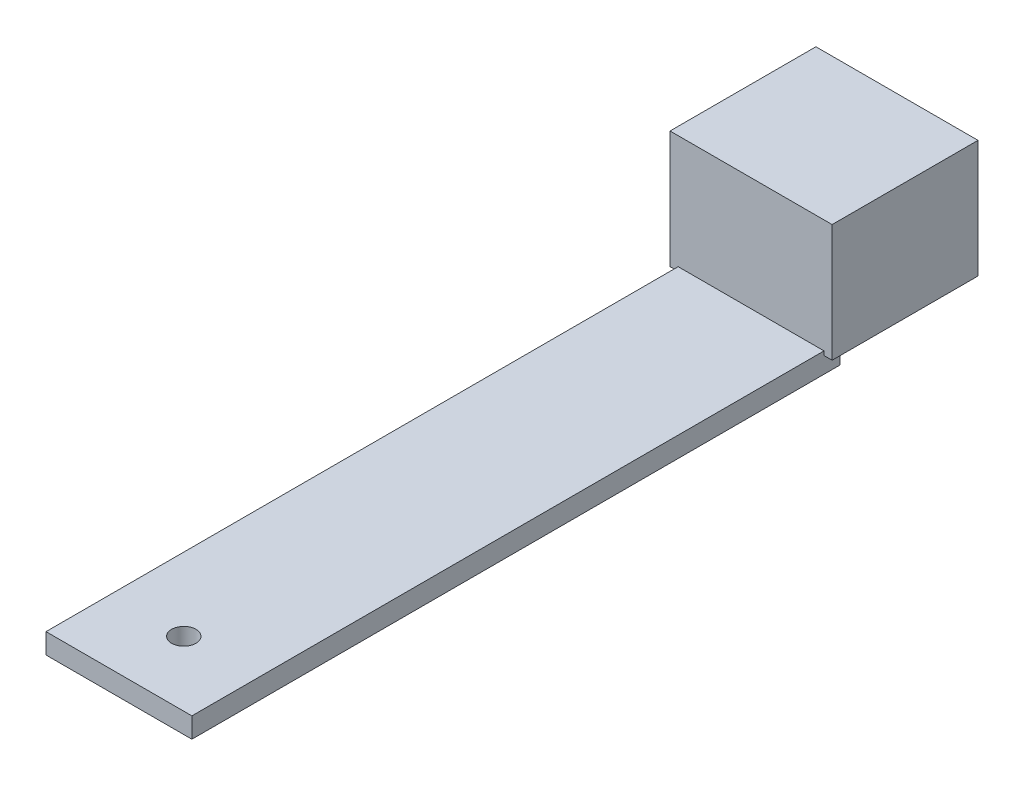
ISO-10303-21;
HEADER;
FILE_DESCRIPTION(('STEP AP214'),'2;1');
FILE_NAME('part.step','',(''),(''),'','','');
FILE_SCHEMA(('AUTOMOTIVE_DESIGN { 1 0 10303 214 1 1 1 1 }'));
ENDSEC;
DATA;
#1=APPLICATION_CONTEXT('core data for automotive mechanical design processes');
#2=APPLICATION_PROTOCOL_DEFINITION('international standard','automotive_design',2000,#1);
#3=PRODUCT_CONTEXT('',#1,'mechanical');
#4=PRODUCT('Part','Part','',(#3));
#5=PRODUCT_RELATED_PRODUCT_CATEGORY('part','',(#4));
#6=PRODUCT_DEFINITION_FORMATION('','',#4);
#7=PRODUCT_DEFINITION_CONTEXT('part definition',#1,'design');
#8=PRODUCT_DEFINITION('design','',#6,#7);
#9=PRODUCT_DEFINITION_SHAPE('','',#8);
#10=(LENGTH_UNIT() NAMED_UNIT(*) SI_UNIT(.MILLI.,.METRE.));
#11=(NAMED_UNIT(*) PLANE_ANGLE_UNIT() SI_UNIT($,.RADIAN.));
#12=(NAMED_UNIT(*) SI_UNIT($,.STERADIAN.) SOLID_ANGLE_UNIT());
#13=UNCERTAINTY_MEASURE_WITH_UNIT(LENGTH_MEASURE(1.E-05),#10,'distance_accuracy_value','');
#14=(GEOMETRIC_REPRESENTATION_CONTEXT(3) GLOBAL_UNCERTAINTY_ASSIGNED_CONTEXT((#13)) GLOBAL_UNIT_ASSIGNED_CONTEXT((#10,
#11,#12)) REPRESENTATION_CONTEXT('',''));
#15=CARTESIAN_POINT('',(0.,0.,0.));
#16=DIRECTION('',(0.,0.,1.));
#17=DIRECTION('',(1.,0.,0.));
#18=AXIS2_PLACEMENT_3D('',#15,#16,#17);
#19=CARTESIAN_POINT('',(-9.,-18.2,7.99999999999999));
#20=DIRECTION('',(1.,0.,0.));
#21=DIRECTION('',(0.,0.,-1.));
#22=AXIS2_PLACEMENT_3D('',#19,#20,#21);
#23=PLANE('',#22);
#24=DIRECTION('',(0.,0.,1.));
#25=VECTOR('',#24,1.);
#26=CARTESIAN_POINT('',(-9.,-18.7,7.99999999999999));
#27=LINE('',#26,#25);
#28=CARTESIAN_POINT('',(-9.,-18.7,-72.));
#29=VERTEX_POINT('',#28);
#30=CARTESIAN_POINT('',(-9.,-18.7,-70.));
#31=VERTEX_POINT('',#30);
#32=EDGE_CURVE('E121',#29,#31,#27,.T.);
#33=ORIENTED_EDGE('',*,*,#32,.F.);
#34=DIRECTION('',(0.,-1.,0.));
#35=VECTOR('',#34,1.);
#36=CARTESIAN_POINT('',(-9.,-18.2,-72.));
#37=LINE('',#36,#35);
#38=CARTESIAN_POINT('',(-9.,-20.7,-72.));
#39=VERTEX_POINT('',#38);
#40=EDGE_CURVE('E154',#29,#39,#37,.T.);
#41=ORIENTED_EDGE('',*,*,#40,.T.);
#42=DIRECTION('',(0.,0.,-1.));
#43=VECTOR('',#42,1.);
#44=CARTESIAN_POINT('',(-9.,-20.7,7.99999999999999));
#45=LINE('',#44,#43);
#46=CARTESIAN_POINT('',(-9.,-20.7,7.99999999999999));
#47=VERTEX_POINT('',#46);
#48=EDGE_CURVE('E178',#47,#39,#45,.T.);
#49=ORIENTED_EDGE('',*,*,#48,.F.);
#50=DIRECTION('',(0.,-1.,0.));
#51=VECTOR('',#50,1.);
#52=CARTESIAN_POINT('',(-9.,-18.2,7.99999999999999));
#53=LINE('',#52,#51);
#54=CARTESIAN_POINT('',(-9.,-18.2,7.99999999999999));
#55=VERTEX_POINT('',#54);
#56=EDGE_CURVE('E156',#55,#47,#53,.T.);
#57=ORIENTED_EDGE('',*,*,#56,.F.);
#58=DIRECTION('',(0.,0.,-1.));
#59=VECTOR('',#58,1.);
#60=CARTESIAN_POINT('',(-9.,-18.2,7.99999999999999));
#61=LINE('',#60,#59);
#62=CARTESIAN_POINT('',(-9.,-18.2,-70.));
#63=VERTEX_POINT('',#62);
#64=EDGE_CURVE('E167',#55,#63,#61,.T.);
#65=ORIENTED_EDGE('',*,*,#64,.T.);
#66=DIRECTION('',(0.,-1.,0.));
#67=VECTOR('',#66,1.);
#68=CARTESIAN_POINT('',(-9.,-18.2,-70.));
#69=LINE('',#68,#67);
#70=EDGE_CURVE('E53',#63,#31,#69,.T.);
#71=ORIENTED_EDGE('',*,*,#70,.T.);
#72=EDGE_LOOP('',(#33,#41,#49,#57,#65,#71));
#73=FACE_BOUND('',#72,.T.);
#74=ADVANCED_FACE('F39',(#73),#23,.F.);
#75=CARTESIAN_POINT('',(9.,-20.7,7.99999999999999));
#76=DIRECTION('',(-1.,0.,0.));
#77=DIRECTION('',(0.,0.,1.));
#78=AXIS2_PLACEMENT_3D('',#75,#76,#77);
#79=PLANE('',#78);
#80=DIRECTION('',(0.,0.,-1.));
#81=VECTOR('',#80,1.);
#82=CARTESIAN_POINT('',(9.,-18.7,7.99999999999999));
#83=LINE('',#82,#81);
#84=CARTESIAN_POINT('',(9.,-18.7,-70.));
#85=VERTEX_POINT('',#84);
#86=CARTESIAN_POINT('',(9.,-18.7,-72.));
#87=VERTEX_POINT('',#86);
#88=EDGE_CURVE('E61',#85,#87,#83,.T.);
#89=ORIENTED_EDGE('',*,*,#88,.F.);
#90=DIRECTION('',(0.,1.,0.));
#91=VECTOR('',#90,1.);
#92=CARTESIAN_POINT('',(9.,-20.7,-70.));
#93=LINE('',#92,#91);
#94=CARTESIAN_POINT('',(9.,-18.2,-70.));
#95=VERTEX_POINT('',#94);
#96=EDGE_CURVE('E155',#85,#95,#93,.T.);
#97=ORIENTED_EDGE('',*,*,#96,.T.);
#98=DIRECTION('',(0.,0.,-1.));
#99=VECTOR('',#98,1.);
#100=CARTESIAN_POINT('',(9.,-18.2,7.99999999999999));
#101=LINE('',#100,#99);
#102=CARTESIAN_POINT('',(9.,-18.2,7.99999999999999));
#103=VERTEX_POINT('',#102);
#104=EDGE_CURVE('E171',#103,#95,#101,.T.);
#105=ORIENTED_EDGE('',*,*,#104,.F.);
#106=DIRECTION('',(0.,1.,0.));
#107=VECTOR('',#106,1.);
#108=CARTESIAN_POINT('',(9.,-20.7,7.99999999999999));
#109=LINE('',#108,#107);
#110=CARTESIAN_POINT('',(9.,-20.7,7.99999999999999));
#111=VERTEX_POINT('',#110);
#112=EDGE_CURVE('E165',#111,#103,#109,.T.);
#113=ORIENTED_EDGE('',*,*,#112,.F.);
#114=DIRECTION('',(0.,0.,-1.));
#115=VECTOR('',#114,1.);
#116=CARTESIAN_POINT('',(9.,-20.7,7.99999999999999));
#117=LINE('',#116,#115);
#118=CARTESIAN_POINT('',(9.,-20.7,-72.));
#119=VERTEX_POINT('',#118);
#120=EDGE_CURVE('E172',#111,#119,#117,.T.);
#121=ORIENTED_EDGE('',*,*,#120,.T.);
#122=DIRECTION('',(0.,1.,0.));
#123=VECTOR('',#122,1.);
#124=CARTESIAN_POINT('',(9.,-20.7,-72.));
#125=LINE('',#124,#123);
#126=EDGE_CURVE('E159',#119,#87,#125,.T.);
#127=ORIENTED_EDGE('',*,*,#126,.T.);
#128=EDGE_LOOP('',(#89,#97,#105,#113,#121,#127));
#129=FACE_BOUND('',#128,.T.);
#130=ADVANCED_FACE('F189',(#129),#79,.F.);
#131=CARTESIAN_POINT('',(0.,0.,-72.));
#132=DIRECTION('',(0.,0.,1.));
#133=DIRECTION('',(1.,0.,0.));
#134=AXIS2_PLACEMENT_3D('',#131,#132,#133);
#135=PLANE('',#134);
#136=DIRECTION('',(-1.,0.,0.));
#137=VECTOR('',#136,1.);
#138=CARTESIAN_POINT('',(0.,-18.7,-72.));
#139=LINE('',#138,#137);
#140=EDGE_CURVE('E50',#87,#29,#139,.T.);
#141=ORIENTED_EDGE('',*,*,#140,.F.);
#142=ORIENTED_EDGE('',*,*,#126,.F.);
#143=DIRECTION('',(1.,0.,0.));
#144=VECTOR('',#143,1.);
#145=CARTESIAN_POINT('',(-9.,-20.7,-72.));
#146=LINE('',#145,#144);
#147=EDGE_CURVE('E169',#39,#119,#146,.T.);
#148=ORIENTED_EDGE('',*,*,#147,.F.);
#149=ORIENTED_EDGE('',*,*,#40,.F.);
#150=EDGE_LOOP('',(#141,#142,#148,#149));
#151=FACE_BOUND('',#150,.T.);
#152=ADVANCED_FACE('F184',(#151),#135,.F.);
#153=CARTESIAN_POINT('',(-9.,-20.7,7.99999999999999));
#154=DIRECTION('',(0.,1.,0.));
#155=DIRECTION('',(0.,0.,1.));
#156=AXIS2_PLACEMENT_3D('',#153,#154,#155);
#157=PLANE('',#156);
#158=CARTESIAN_POINT('',(0.,-20.7,0.));
#159=DIRECTION('',(0.,1.,0.));
#160=DIRECTION('',(0.,0.,1.));
#161=AXIS2_PLACEMENT_3D('',#158,#159,#160);
#162=CIRCLE('',#161,1.5);
#163=CARTESIAN_POINT('',(0.,-20.7,1.5));
#164=VERTEX_POINT('',#163);
#165=EDGE_CURVE('E209',#164,#164,#162,.F.);
#166=ORIENTED_EDGE('',*,*,#165,.F.);
#167=EDGE_LOOP('',(#166));
#168=FACE_BOUND('',#167,.T.);
#169=ORIENTED_EDGE('',*,*,#147,.T.);
#170=ORIENTED_EDGE('',*,*,#120,.F.);
#171=DIRECTION('',(1.,0.,0.));
#172=VECTOR('',#171,1.);
#173=CARTESIAN_POINT('',(-9.,-20.7,7.99999999999999));
#174=LINE('',#173,#172);
#175=EDGE_CURVE('E157',#47,#111,#174,.T.);
#176=ORIENTED_EDGE('',*,*,#175,.F.);
#177=ORIENTED_EDGE('',*,*,#48,.T.);
#178=EDGE_LOOP('',(#169,#170,#176,#177));
#179=FACE_BOUND('',#178,.T.);
#180=ADVANCED_FACE('F192',(#168,#179),#157,.F.);
#181=CARTESIAN_POINT('',(9.,-18.2,7.99999999999999));
#182=DIRECTION('',(0.,-1.,0.));
#183=DIRECTION('',(0.,0.,-1.));
#184=AXIS2_PLACEMENT_3D('',#181,#182,#183);
#185=PLANE('',#184);
#186=CARTESIAN_POINT('',(0.,-18.2,0.));
#187=DIRECTION('',(0.,-1.,0.));
#188=DIRECTION('',(0.,0.,-1.));
#189=AXIS2_PLACEMENT_3D('',#186,#187,#188);
#190=CIRCLE('',#189,1.5);
#191=CARTESIAN_POINT('',(0.,-18.2,-1.5));
#192=VERTEX_POINT('',#191);
#193=EDGE_CURVE('E45',#192,#192,#190,.F.);
#194=ORIENTED_EDGE('',*,*,#193,.F.);
#195=EDGE_LOOP('',(#194));
#196=FACE_BOUND('',#195,.T.);
#197=ORIENTED_EDGE('',*,*,#104,.T.);
#198=DIRECTION('',(-1.,0.,0.));
#199=VECTOR('',#198,1.);
#200=CARTESIAN_POINT('',(9.,-18.2,-70.));
#201=LINE('',#200,#199);
#202=EDGE_CURVE('E11',#95,#63,#201,.T.);
#203=ORIENTED_EDGE('',*,*,#202,.T.);
#204=ORIENTED_EDGE('',*,*,#64,.F.);
#205=DIRECTION('',(-1.,0.,0.));
#206=VECTOR('',#205,1.);
#207=CARTESIAN_POINT('',(9.,-18.2,7.99999999999999));
#208=LINE('',#207,#206);
#209=EDGE_CURVE('E163',#103,#55,#208,.T.);
#210=ORIENTED_EDGE('',*,*,#209,.F.);
#211=EDGE_LOOP('',(#197,#203,#204,#210));
#212=FACE_BOUND('',#211,.T.);
#213=ADVANCED_FACE('F200',(#196,#212),#185,.F.);
#214=CARTESIAN_POINT('',(0.,0.,7.99999999999999));
#215=DIRECTION('',(0.,0.,1.));
#216=DIRECTION('',(1.,0.,0.));
#217=AXIS2_PLACEMENT_3D('',#214,#215,#216);
#218=PLANE('',#217);
#219=ORIENTED_EDGE('',*,*,#56,.T.);
#220=ORIENTED_EDGE('',*,*,#175,.T.);
#221=ORIENTED_EDGE('',*,*,#112,.T.);
#222=ORIENTED_EDGE('',*,*,#209,.T.);
#223=EDGE_LOOP('',(#219,#220,#221,#222));
#224=FACE_BOUND('',#223,.T.);
#225=ADVANCED_FACE('F198',(#224),#218,.T.);
#226=CARTESIAN_POINT('',(0.,0.,-70.));
#227=DIRECTION('',(0.,0.,1.));
#228=DIRECTION('',(1.,0.,0.));
#229=AXIS2_PLACEMENT_3D('',#226,#227,#228);
#230=PLANE('',#229);
#231=ORIENTED_EDGE('',*,*,#70,.F.);
#232=ORIENTED_EDGE('',*,*,#202,.F.);
#233=ORIENTED_EDGE('',*,*,#96,.F.);
#234=DIRECTION('',(1.,0.,0.));
#235=VECTOR('',#234,1.);
#236=CARTESIAN_POINT('',(-10.,-18.7,-70.));
#237=LINE('',#236,#235);
#238=CARTESIAN_POINT('',(10.,-18.7,-70.));
#239=VERTEX_POINT('',#238);
#240=EDGE_CURVE('E126',#85,#239,#237,.T.);
#241=ORIENTED_EDGE('',*,*,#240,.T.);
#242=DIRECTION('',(0.,1.,0.));
#243=VECTOR('',#242,1.);
#244=CARTESIAN_POINT('',(10.,-18.7,-70.));
#245=LINE('',#244,#243);
#246=CARTESIAN_POINT('',(10.,-4.2,-70.));
#247=VERTEX_POINT('',#246);
#248=EDGE_CURVE('E130',#239,#247,#245,.T.);
#249=ORIENTED_EDGE('',*,*,#248,.T.);
#250=DIRECTION('',(-1.,0.,0.));
#251=VECTOR('',#250,1.);
#252=CARTESIAN_POINT('',(10.,-4.2,-70.));
#253=LINE('',#252,#251);
#254=CARTESIAN_POINT('',(-10.,-4.2,-70.));
#255=VERTEX_POINT('',#254);
#256=EDGE_CURVE('E133',#247,#255,#253,.T.);
#257=ORIENTED_EDGE('',*,*,#256,.T.);
#258=DIRECTION('',(0.,-1.,0.));
#259=VECTOR('',#258,1.);
#260=CARTESIAN_POINT('',(-10.,-4.2,-70.));
#261=LINE('',#260,#259);
#262=CARTESIAN_POINT('',(-10.,-18.7,-70.));
#263=VERTEX_POINT('',#262);
#264=EDGE_CURVE('E134',#255,#263,#261,.T.);
#265=ORIENTED_EDGE('',*,*,#264,.T.);
#266=EDGE_CURVE('E120',#263,#31,#237,.T.);
#267=ORIENTED_EDGE('',*,*,#266,.T.);
#268=EDGE_LOOP('',(#231,#232,#233,#241,#249,#257,#265,#267));
#269=FACE_BOUND('',#268,.T.);
#270=ADVANCED_FACE('F131',(#269),#230,.T.);
#271=CARTESIAN_POINT('',(-10.,-18.7,-70.));
#272=DIRECTION('',(0.,1.,0.));
#273=DIRECTION('',(0.,0.,1.));
#274=AXIS2_PLACEMENT_3D('',#271,#272,#273);
#275=PLANE('',#274);
#276=ORIENTED_EDGE('',*,*,#140,.T.);
#277=ORIENTED_EDGE('',*,*,#32,.T.);
#278=ORIENTED_EDGE('',*,*,#266,.F.);
#279=DIRECTION('',(0.,0.,-1.));
#280=VECTOR('',#279,1.);
#281=CARTESIAN_POINT('',(-10.,-18.7,-70.));
#282=LINE('',#281,#280);
#283=CARTESIAN_POINT('',(-10.,-18.7,-88.));
#284=VERTEX_POINT('',#283);
#285=EDGE_CURVE('E123',#263,#284,#282,.T.);
#286=ORIENTED_EDGE('',*,*,#285,.T.);
#287=DIRECTION('',(1.,0.,0.));
#288=VECTOR('',#287,1.);
#289=CARTESIAN_POINT('',(-10.,-18.7,-88.));
#290=LINE('',#289,#288);
#291=CARTESIAN_POINT('',(10.,-18.7,-88.));
#292=VERTEX_POINT('',#291);
#293=EDGE_CURVE('E207',#284,#292,#290,.T.);
#294=ORIENTED_EDGE('',*,*,#293,.T.);
#295=DIRECTION('',(0.,0.,-1.));
#296=VECTOR('',#295,1.);
#297=CARTESIAN_POINT('',(10.,-18.7,-70.));
#298=LINE('',#297,#296);
#299=EDGE_CURVE('E141',#239,#292,#298,.T.);
#300=ORIENTED_EDGE('',*,*,#299,.F.);
#301=ORIENTED_EDGE('',*,*,#240,.F.);
#302=ORIENTED_EDGE('',*,*,#88,.T.);
#303=EDGE_LOOP('',(#276,#277,#278,#286,#294,#300,#301,#302));
#304=FACE_BOUND('',#303,.T.);
#305=ADVANCED_FACE('F122',(#304),#275,.F.);
#306=CARTESIAN_POINT('',(-10.,-4.2,-70.));
#307=DIRECTION('',(1.,0.,0.));
#308=DIRECTION('',(0.,0.,-1.));
#309=AXIS2_PLACEMENT_3D('',#306,#307,#308);
#310=PLANE('',#309);
#311=DIRECTION('',(0.,-1.,0.));
#312=VECTOR('',#311,1.);
#313=CARTESIAN_POINT('',(-10.,-4.2,-88.));
#314=LINE('',#313,#312);
#315=CARTESIAN_POINT('',(-10.,-4.2,-88.));
#316=VERTEX_POINT('',#315);
#317=EDGE_CURVE('E142',#316,#284,#314,.T.);
#318=ORIENTED_EDGE('',*,*,#317,.T.);
#319=ORIENTED_EDGE('',*,*,#285,.F.);
#320=ORIENTED_EDGE('',*,*,#264,.F.);
#321=DIRECTION('',(0.,0.,-1.));
#322=VECTOR('',#321,1.);
#323=CARTESIAN_POINT('',(-10.,-4.2,-70.));
#324=LINE('',#323,#322);
#325=EDGE_CURVE('E210',#255,#316,#324,.T.);
#326=ORIENTED_EDGE('',*,*,#325,.T.);
#327=EDGE_LOOP('',(#318,#319,#320,#326));
#328=FACE_BOUND('',#327,.T.);
#329=ADVANCED_FACE('F136',(#328),#310,.F.);
#330=CARTESIAN_POINT('',(10.,-18.7,-70.));
#331=DIRECTION('',(-1.,0.,0.));
#332=DIRECTION('',(0.,0.,1.));
#333=AXIS2_PLACEMENT_3D('',#330,#331,#332);
#334=PLANE('',#333);
#335=DIRECTION('',(0.,1.,0.));
#336=VECTOR('',#335,1.);
#337=CARTESIAN_POINT('',(10.,-18.7,-88.));
#338=LINE('',#337,#336);
#339=CARTESIAN_POINT('',(10.,-4.2,-88.));
#340=VERTEX_POINT('',#339);
#341=EDGE_CURVE('E215',#292,#340,#338,.T.);
#342=ORIENTED_EDGE('',*,*,#341,.T.);
#343=DIRECTION('',(0.,0.,-1.));
#344=VECTOR('',#343,1.);
#345=CARTESIAN_POINT('',(10.,-4.2,-70.));
#346=LINE('',#345,#344);
#347=EDGE_CURVE('E150',#247,#340,#346,.T.);
#348=ORIENTED_EDGE('',*,*,#347,.F.);
#349=ORIENTED_EDGE('',*,*,#248,.F.);
#350=ORIENTED_EDGE('',*,*,#299,.T.);
#351=EDGE_LOOP('',(#342,#348,#349,#350));
#352=FACE_BOUND('',#351,.T.);
#353=ADVANCED_FACE('F221',(#352),#334,.F.);
#354=CARTESIAN_POINT('',(10.,-4.2,-70.));
#355=DIRECTION('',(0.,-1.,0.));
#356=DIRECTION('',(0.,0.,-1.));
#357=AXIS2_PLACEMENT_3D('',#354,#355,#356);
#358=PLANE('',#357);
#359=DIRECTION('',(-1.,0.,0.));
#360=VECTOR('',#359,1.);
#361=CARTESIAN_POINT('',(10.,-4.2,-88.));
#362=LINE('',#361,#360);
#363=EDGE_CURVE('E138',#340,#316,#362,.T.);
#364=ORIENTED_EDGE('',*,*,#363,.T.);
#365=ORIENTED_EDGE('',*,*,#325,.F.);
#366=ORIENTED_EDGE('',*,*,#256,.F.);
#367=ORIENTED_EDGE('',*,*,#347,.T.);
#368=EDGE_LOOP('',(#364,#365,#366,#367));
#369=FACE_BOUND('',#368,.T.);
#370=ADVANCED_FACE('F218',(#369),#358,.F.);
#371=CARTESIAN_POINT('',(0.,0.,-88.));
#372=DIRECTION('',(0.,0.,1.));
#373=DIRECTION('',(1.,0.,0.));
#374=AXIS2_PLACEMENT_3D('',#371,#372,#373);
#375=PLANE('',#374);
#376=ORIENTED_EDGE('',*,*,#317,.F.);
#377=ORIENTED_EDGE('',*,*,#363,.F.);
#378=ORIENTED_EDGE('',*,*,#341,.F.);
#379=ORIENTED_EDGE('',*,*,#293,.F.);
#380=EDGE_LOOP('',(#376,#377,#378,#379));
#381=FACE_BOUND('',#380,.T.);
#382=ADVANCED_FACE('F224',(#381),#375,.F.);
#383=CARTESIAN_POINT('',(0.,-18.1,0.));
#384=DIRECTION('',(0.,-1.,0.));
#385=DIRECTION('',(0.,0.,-1.));
#386=AXIS2_PLACEMENT_3D('',#383,#384,#385);
#387=CYLINDRICAL_SURFACE('',#386,1.5);
#388=ORIENTED_EDGE('',*,*,#193,.T.);
#389=EDGE_LOOP('',(#388));
#390=FACE_BOUND('',#389,.T.);
#391=ORIENTED_EDGE('',*,*,#165,.T.);
#392=EDGE_LOOP('',(#391));
#393=FACE_BOUND('',#392,.T.);
#394=ADVANCED_FACE('F256',(#390,#393),#387,.F.);
#395=CLOSED_SHELL('',(#74,#130,#152,#180,#213,#225,#270,#305,#329,#353,#370,#382,#394));
#396=MANIFOLD_SOLID_BREP('B2',#395);
#397=ADVANCED_BREP_SHAPE_REPRESENTATION('',(#18,#396),#14);
#398=SHAPE_DEFINITION_REPRESENTATION(#9,#397);
ENDSEC;
END-ISO-10303-21;
